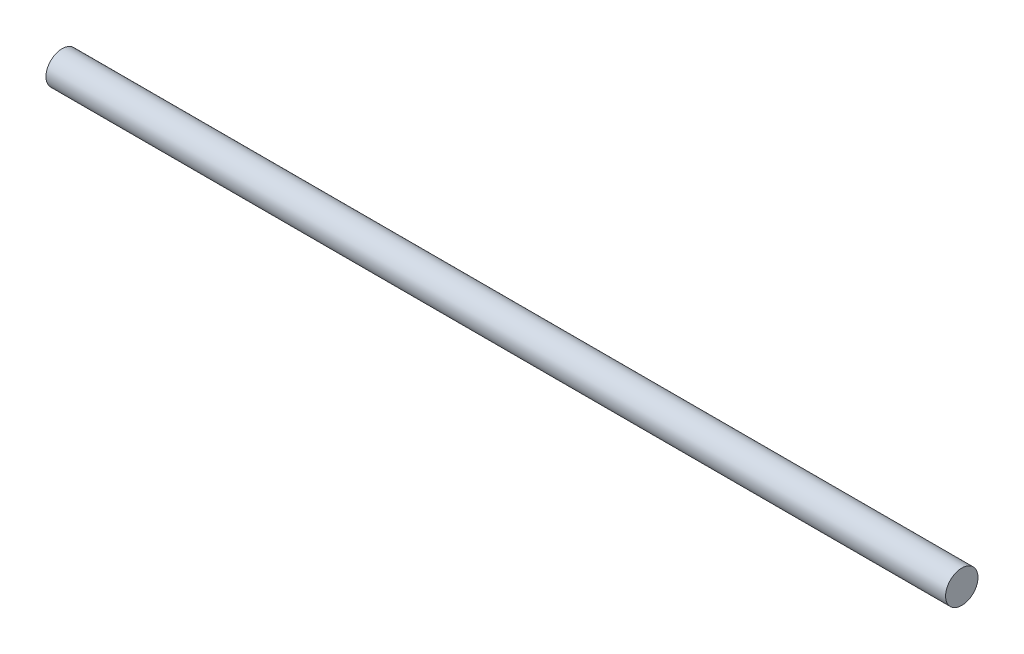
ISO-10303-21;
HEADER;
FILE_DESCRIPTION(('STEP AP214'),'2;1');
FILE_NAME('part.step','',(''),(''),'','','');
FILE_SCHEMA(('AUTOMOTIVE_DESIGN { 1 0 10303 214 1 1 1 1 }'));
ENDSEC;
DATA;
#1=APPLICATION_CONTEXT('core data for automotive mechanical design processes');
#2=APPLICATION_PROTOCOL_DEFINITION('international standard','automotive_design',2000,#1);
#3=PRODUCT_CONTEXT('',#1,'mechanical');
#4=PRODUCT('Part','Part','',(#3));
#5=PRODUCT_RELATED_PRODUCT_CATEGORY('part','',(#4));
#6=PRODUCT_DEFINITION_FORMATION('','',#4);
#7=PRODUCT_DEFINITION_CONTEXT('part definition',#1,'design');
#8=PRODUCT_DEFINITION('design','',#6,#7);
#9=PRODUCT_DEFINITION_SHAPE('','',#8);
#10=(LENGTH_UNIT() NAMED_UNIT(*) SI_UNIT(.MILLI.,.METRE.));
#11=(NAMED_UNIT(*) PLANE_ANGLE_UNIT() SI_UNIT($,.RADIAN.));
#12=(NAMED_UNIT(*) SI_UNIT($,.STERADIAN.) SOLID_ANGLE_UNIT());
#13=UNCERTAINTY_MEASURE_WITH_UNIT(LENGTH_MEASURE(1.E-05),#10,'distance_accuracy_value','');
#14=(GEOMETRIC_REPRESENTATION_CONTEXT(3) GLOBAL_UNCERTAINTY_ASSIGNED_CONTEXT((#13)) GLOBAL_UNIT_ASSIGNED_CONTEXT((#10,
#11,#12)) REPRESENTATION_CONTEXT('',''));
#15=CARTESIAN_POINT('',(0.,0.,0.));
#16=DIRECTION('',(0.,0.,1.));
#17=DIRECTION('',(1.,0.,0.));
#18=AXIS2_PLACEMENT_3D('',#15,#16,#17);
#19=CARTESIAN_POINT('',(222.,0.,0.));
#20=DIRECTION('',(-1.,0.,0.));
#21=DIRECTION('',(0.,0.,1.));
#22=AXIS2_PLACEMENT_3D('',#19,#20,#21);
#23=CYLINDRICAL_SURFACE('',#22,4.);
#24=CARTESIAN_POINT('',(222.,0.,0.));
#25=DIRECTION('',(1.,0.,0.));
#26=DIRECTION('',(0.,0.,-1.));
#27=AXIS2_PLACEMENT_3D('',#24,#25,#26);
#28=CIRCLE('',#27,4.);
#29=CARTESIAN_POINT('',(222.,0.,-4.));
#30=VERTEX_POINT('',#29);
#31=EDGE_CURVE('E10',#30,#30,#28,.T.);
#32=ORIENTED_EDGE('',*,*,#31,.F.);
#33=EDGE_LOOP('',(#32));
#34=FACE_BOUND('',#33,.T.);
#35=CARTESIAN_POINT('',(0.,0.,0.));
#36=DIRECTION('',(1.,0.,0.));
#37=DIRECTION('',(0.,0.,-1.));
#38=AXIS2_PLACEMENT_3D('',#35,#36,#37);
#39=CIRCLE('',#38,4.);
#40=CARTESIAN_POINT('',(0.,0.,-4.));
#41=VERTEX_POINT('',#40);
#42=EDGE_CURVE('E46',#41,#41,#39,.T.);
#43=ORIENTED_EDGE('',*,*,#42,.T.);
#44=EDGE_LOOP('',(#43));
#45=FACE_BOUND('',#44,.T.);
#46=ADVANCED_FACE('F43',(#34,#45),#23,.T.);
#47=CARTESIAN_POINT('',(222.,0.,0.));
#48=DIRECTION('',(1.,0.,0.));
#49=DIRECTION('',(0.,0.,-1.));
#50=AXIS2_PLACEMENT_3D('',#47,#48,#49);
#51=PLANE('',#50);
#52=ORIENTED_EDGE('',*,*,#31,.T.);
#53=EDGE_LOOP('',(#52));
#54=FACE_BOUND('',#53,.T.);
#55=ADVANCED_FACE('F60',(#54),#51,.T.);
#56=CARTESIAN_POINT('',(0.,0.,0.));
#57=DIRECTION('',(1.,0.,0.));
#58=DIRECTION('',(0.,0.,-1.));
#59=AXIS2_PLACEMENT_3D('',#56,#57,#58);
#60=PLANE('',#59);
#61=ORIENTED_EDGE('',*,*,#42,.F.);
#62=EDGE_LOOP('',(#61));
#63=FACE_BOUND('',#62,.T.);
#64=ADVANCED_FACE('F58',(#63),#60,.F.);
#65=CLOSED_SHELL('',(#46,#55,#64));
#66=MANIFOLD_SOLID_BREP('B2',#65);
#67=ADVANCED_BREP_SHAPE_REPRESENTATION('',(#18,#66),#14);
#68=SHAPE_DEFINITION_REPRESENTATION(#9,#67);
ENDSEC;
END-ISO-10303-21;
